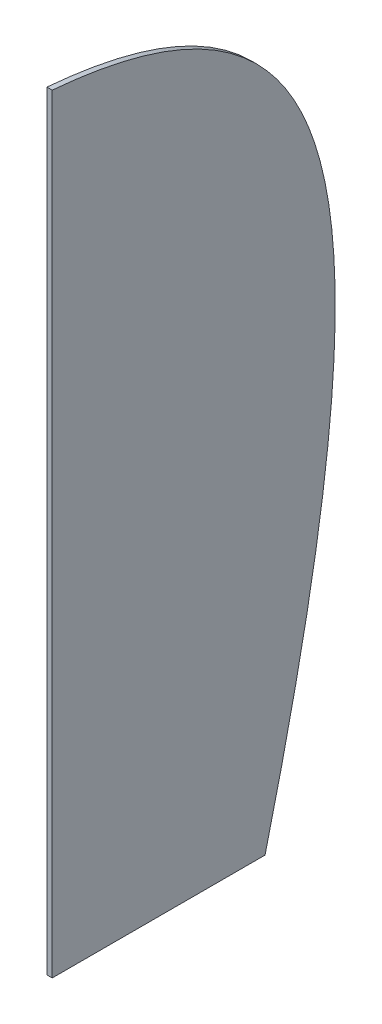
ISO-10303-21;
HEADER;
FILE_DESCRIPTION(('STEP AP214'),'2;1');
FILE_NAME('part.step','',(''),(''),'','','');
FILE_SCHEMA(('AUTOMOTIVE_DESIGN { 1 0 10303 214 1 1 1 1 }'));
ENDSEC;
DATA;
#1=APPLICATION_CONTEXT('core data for automotive mechanical design processes');
#2=APPLICATION_PROTOCOL_DEFINITION('international standard','automotive_design',2000,#1);
#3=PRODUCT_CONTEXT('',#1,'mechanical');
#4=PRODUCT('Part','Part','',(#3));
#5=PRODUCT_RELATED_PRODUCT_CATEGORY('part','',(#4));
#6=PRODUCT_DEFINITION_FORMATION('','',#4);
#7=PRODUCT_DEFINITION_CONTEXT('part definition',#1,'design');
#8=PRODUCT_DEFINITION('design','',#6,#7);
#9=PRODUCT_DEFINITION_SHAPE('','',#8);
#10=(LENGTH_UNIT() NAMED_UNIT(*) SI_UNIT(.MILLI.,.METRE.));
#11=(NAMED_UNIT(*) PLANE_ANGLE_UNIT() SI_UNIT($,.RADIAN.));
#12=(NAMED_UNIT(*) SI_UNIT($,.STERADIAN.) SOLID_ANGLE_UNIT());
#13=UNCERTAINTY_MEASURE_WITH_UNIT(LENGTH_MEASURE(1.E-05),#10,'distance_accuracy_value','');
#14=(GEOMETRIC_REPRESENTATION_CONTEXT(3) GLOBAL_UNCERTAINTY_ASSIGNED_CONTEXT((#13)) GLOBAL_UNIT_ASSIGNED_CONTEXT((#10,
#11,#12)) REPRESENTATION_CONTEXT('',''));
#15=CARTESIAN_POINT('',(0.,0.,0.));
#16=DIRECTION('',(0.,0.,1.));
#17=DIRECTION('',(1.,0.,0.));
#18=AXIS2_PLACEMENT_3D('',#15,#16,#17);
#19=CARTESIAN_POINT('',(0.50000000000014,1.48569608268425E-13,-40.1439662287613));
#20=DIRECTION('',(0.,1.,0.));
#21=DIRECTION('',(0.,0.,1.));
#22=AXIS2_PLACEMENT_3D('',#19,#20,#21);
#23=PLANE('',#22);
#24=DIRECTION('',(0.,0.,-1.));
#25=VECTOR('',#24,1.);
#26=CARTESIAN_POINT('',(-0.49999999999986,1.41586645590739E-13,-40.1439662287613));
#27=LINE('',#26,#25);
#28=CARTESIAN_POINT('',(-0.5,0.,0.));
#29=VERTEX_POINT('',#28);
#30=CARTESIAN_POINT('',(-0.49999999999986,1.41586645590739E-13,-40.1439662287613));
#31=VERTEX_POINT('',#30);
#32=EDGE_CURVE('E66',#29,#31,#27,.T.);
#33=ORIENTED_EDGE('',*,*,#32,.T.);
#34=DIRECTION('',(-1.,0.,0.));
#35=VECTOR('',#34,1.);
#36=CARTESIAN_POINT('',(0.50000000000014,1.48569608268425E-13,-40.1439662287613));
#37=LINE('',#36,#35);
#38=CARTESIAN_POINT('',(0.50000000000014,1.48569608268425E-13,-40.1439662287613));
#39=VERTEX_POINT('',#38);
#40=EDGE_CURVE('E44',#39,#31,#37,.T.);
#41=ORIENTED_EDGE('',*,*,#40,.F.);
#42=DIRECTION('',(0.,0.,-1.));
#43=VECTOR('',#42,1.);
#44=CARTESIAN_POINT('',(0.50000000000014,1.48569608268425E-13,-40.1439662287613));
#45=LINE('',#44,#43);
#46=CARTESIAN_POINT('',(0.5,0.,0.));
#47=VERTEX_POINT('',#46);
#48=EDGE_CURVE('E74',#47,#39,#45,.T.);
#49=ORIENTED_EDGE('',*,*,#48,.F.);
#50=DIRECTION('',(-1.,0.,0.));
#51=VECTOR('',#50,1.);
#52=CARTESIAN_POINT('',(0.5,0.,0.));
#53=LINE('',#52,#51);
#54=EDGE_CURVE('E11',#47,#29,#53,.T.);
#55=ORIENTED_EDGE('',*,*,#54,.T.);
#56=EDGE_LOOP('',(#33,#41,#49,#55));
#57=FACE_BOUND('',#56,.T.);
#58=ADVANCED_FACE('F36',(#57),#23,.F.);
#59=CARTESIAN_POINT('',(0.50000000000014,1.48569608268425E-13,-40.1439662287613));
#60=CARTESIAN_POINT('',(0.499999999999553,96.1055639621332,-64.0701194417086));
#61=CARTESIAN_POINT('',(0.499999999999226,140.053769681774,-58.2824836294395));
#62=CARTESIAN_POINT('',(0.499999999998987,145.,5.08010534801672E-13));
#63=B_SPLINE_CURVE_WITH_KNOTS('',3,(#59,#60,#61,#62),.UNSPECIFIED.,.F.,.F.,(4,4),(0.,1.),.UNSPECIFIED.);
#64=DIRECTION('',(-1.,0.,0.));
#65=VECTOR('',#64,1.);
#66=SURFACE_OF_LINEAR_EXTRUSION('',#63,#65);
#67=CARTESIAN_POINT('',(-0.49999999999986,1.41586645590739E-13,-40.1439662287613));
#68=CARTESIAN_POINT('',(-0.500000000000447,96.1055639621332,-64.0701194417086));
#69=CARTESIAN_POINT('',(-0.500000000000774,140.053769681774,-58.2824836294395));
#70=CARTESIAN_POINT('',(-0.500000000001013,145.,5.04519053462829E-13));
#71=B_SPLINE_CURVE_WITH_KNOTS('',3,(#67,#68,#69,#70),.UNSPECIFIED.,.F.,.F.,(4,4),(0.,1.),.UNSPECIFIED.);
#72=CARTESIAN_POINT('',(-0.500000000001013,145.,5.04519053462829E-13));
#73=VERTEX_POINT('',#72);
#74=EDGE_CURVE('E72',#31,#73,#71,.T.);
#75=ORIENTED_EDGE('',*,*,#74,.T.);
#76=DIRECTION('',(-1.,0.,0.));
#77=VECTOR('',#76,1.);
#78=CARTESIAN_POINT('',(0.499999999998987,145.,5.08010534801672E-13));
#79=LINE('',#78,#77);
#80=CARTESIAN_POINT('',(0.499999999998987,145.,5.08010534801672E-13));
#81=VERTEX_POINT('',#80);
#82=EDGE_CURVE('E84',#81,#73,#79,.T.);
#83=ORIENTED_EDGE('',*,*,#82,.F.);
#84=EDGE_CURVE('E77',#39,#81,#63,.T.);
#85=ORIENTED_EDGE('',*,*,#84,.F.);
#86=ORIENTED_EDGE('',*,*,#40,.T.);
#87=EDGE_LOOP('',(#75,#83,#85,#86));
#88=FACE_BOUND('',#87,.T.);
#89=ADVANCED_FACE('F100',(#88),#66,.F.);
#90=CARTESIAN_POINT('',(0.499999999999895,15.,0.));
#91=DIRECTION('',(0.,0.,-1.));
#92=DIRECTION('',(0.,1.,0.));
#93=AXIS2_PLACEMENT_3D('',#90,#91,#92);
#94=PLANE('',#93);
#95=DIRECTION('',(0.,-1.,0.));
#96=VECTOR('',#95,1.);
#97=CARTESIAN_POINT('',(-0.500000000000105,15.,0.));
#98=LINE('',#97,#96);
#99=EDGE_CURVE('E80',#73,#29,#98,.T.);
#100=ORIENTED_EDGE('',*,*,#99,.T.);
#101=ORIENTED_EDGE('',*,*,#54,.F.);
#102=DIRECTION('',(0.,-1.,0.));
#103=VECTOR('',#102,1.);
#104=CARTESIAN_POINT('',(0.5,0.,0.));
#105=LINE('',#104,#103);
#106=EDGE_CURVE('E52',#81,#47,#105,.T.);
#107=ORIENTED_EDGE('',*,*,#106,.F.);
#108=ORIENTED_EDGE('',*,*,#82,.T.);
#109=EDGE_LOOP('',(#100,#101,#107,#108));
#110=FACE_BOUND('',#109,.T.);
#111=ADVANCED_FACE('F82',(#110),#94,.F.);
#112=CARTESIAN_POINT('',(0.499999999999433,106.684750116465,-50.9002219302756));
#113=DIRECTION('',(-1.,0.,0.));
#114=DIRECTION('',(0.,-1.,0.));
#115=AXIS2_PLACEMENT_3D('',#112,#113,#114);
#116=PLANE('',#115);
#117=ORIENTED_EDGE('',*,*,#106,.T.);
#118=ORIENTED_EDGE('',*,*,#48,.T.);
#119=ORIENTED_EDGE('',*,*,#84,.T.);
#120=EDGE_LOOP('',(#117,#118,#119));
#121=FACE_BOUND('',#120,.T.);
#122=ADVANCED_FACE('F79',(#121),#116,.F.);
#123=CARTESIAN_POINT('',(-0.500000000000567,106.684750116465,-50.9002219302756));
#124=DIRECTION('',(-1.,0.,0.));
#125=DIRECTION('',(0.,-1.,0.));
#126=AXIS2_PLACEMENT_3D('',#123,#124,#125);
#127=PLANE('',#126);
#128=ORIENTED_EDGE('',*,*,#32,.F.);
#129=ORIENTED_EDGE('',*,*,#99,.F.);
#130=ORIENTED_EDGE('',*,*,#74,.F.);
#131=EDGE_LOOP('',(#128,#129,#130));
#132=FACE_BOUND('',#131,.T.);
#133=ADVANCED_FACE('F87',(#132),#127,.T.);
#134=CLOSED_SHELL('',(#58,#89,#111,#122,#133));
#135=MANIFOLD_SOLID_BREP('B2',#134);
#136=ADVANCED_BREP_SHAPE_REPRESENTATION('',(#18,#135),#14);
#137=SHAPE_DEFINITION_REPRESENTATION(#9,#136);
ENDSEC;
END-ISO-10303-21;
